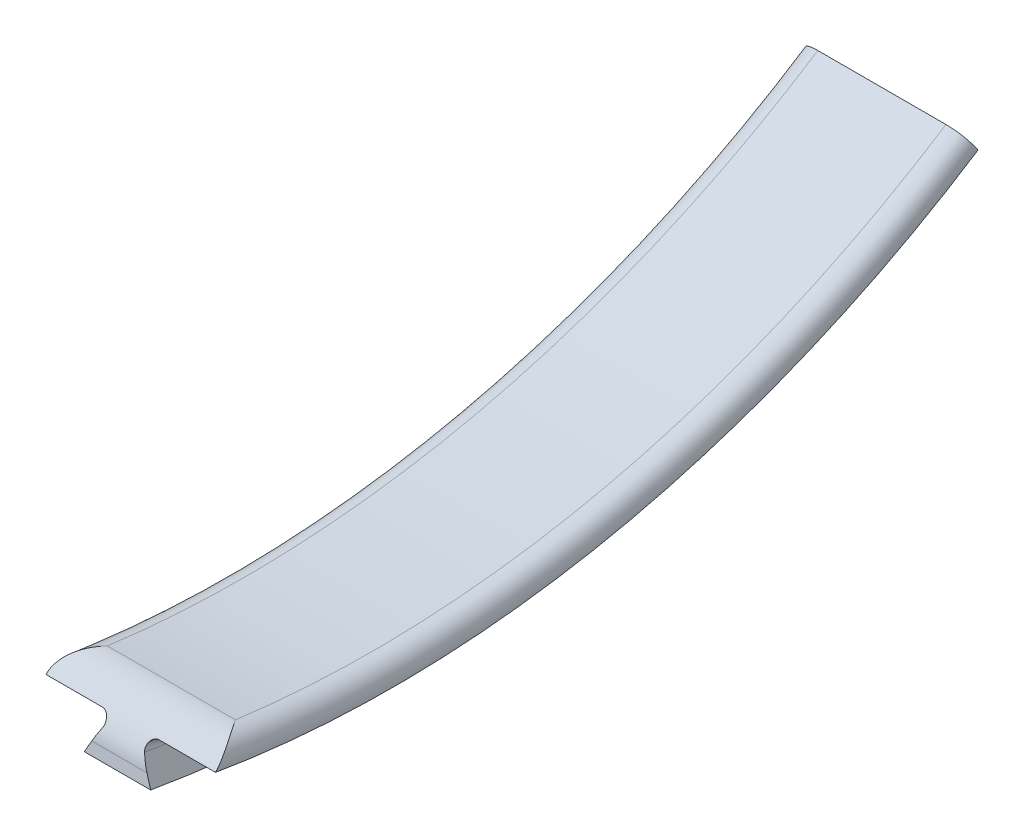
ISO-10303-21;
HEADER;
FILE_DESCRIPTION(('STEP AP214'),'2;1');
FILE_NAME('part.step','',(''),(''),'','','');
FILE_SCHEMA(('AUTOMOTIVE_DESIGN { 1 0 10303 214 1 1 1 1 }'));
ENDSEC;
DATA;
#1=APPLICATION_CONTEXT('core data for automotive mechanical design processes');
#2=APPLICATION_PROTOCOL_DEFINITION('international standard','automotive_design',2000,#1);
#3=PRODUCT_CONTEXT('',#1,'mechanical');
#4=PRODUCT('Part','Part','',(#3));
#5=PRODUCT_RELATED_PRODUCT_CATEGORY('part','',(#4));
#6=PRODUCT_DEFINITION_FORMATION('','',#4);
#7=PRODUCT_DEFINITION_CONTEXT('part definition',#1,'design');
#8=PRODUCT_DEFINITION('design','',#6,#7);
#9=PRODUCT_DEFINITION_SHAPE('','',#8);
#10=(LENGTH_UNIT() NAMED_UNIT(*) SI_UNIT(.MILLI.,.METRE.));
#11=(NAMED_UNIT(*) PLANE_ANGLE_UNIT() SI_UNIT($,.RADIAN.));
#12=(NAMED_UNIT(*) SI_UNIT($,.STERADIAN.) SOLID_ANGLE_UNIT());
#13=UNCERTAINTY_MEASURE_WITH_UNIT(LENGTH_MEASURE(1.E-05),#10,'distance_accuracy_value','');
#14=(GEOMETRIC_REPRESENTATION_CONTEXT(3) GLOBAL_UNCERTAINTY_ASSIGNED_CONTEXT((#13)) GLOBAL_UNIT_ASSIGNED_CONTEXT((#10,
#11,#12)) REPRESENTATION_CONTEXT('',''));
#15=CARTESIAN_POINT('',(0.,0.,0.));
#16=DIRECTION('',(0.,0.,1.));
#17=DIRECTION('',(1.,0.,0.));
#18=AXIS2_PLACEMENT_3D('',#15,#16,#17);
#19=CARTESIAN_POINT('',(-2.75,0.,0.));
#20=DIRECTION('',(-1.,0.,0.));
#21=DIRECTION('',(0.,0.,1.));
#22=AXIS2_PLACEMENT_3D('',#19,#20,#21);
#23=TOROIDAL_SURFACE('',#22,46.,0.890624999999996);
#24=CARTESIAN_POINT('',(-3.64062500000001,0.,0.));
#25=DIRECTION('',(-1.,0.,0.));
#26=DIRECTION('',(0.,0.,1.));
#27=AXIS2_PLACEMENT_3D('',#24,#25,#26);
#28=CIRCLE('',#27,46.);
#29=CARTESIAN_POINT('',(-3.64062499999999,-38.5788461254896,-25.0533956106914));
#30=VERTEX_POINT('',#29);
#31=CARTESIAN_POINT('',(-3.640625,-45.3537906221012,7.68333756948193));
#32=VERTEX_POINT('',#31);
#33=EDGE_CURVE('E178',#30,#32,#28,.T.);
#34=ORIENTED_EDGE('',*,*,#33,.T.);
#35=CARTESIAN_POINT('',(-3.640625,-45.3537906221012,7.68333756948193));
#36=CARTESIAN_POINT('',(-3.64062274567191,-45.3254309579792,7.65756518256237));
#37=CARTESIAN_POINT('',(-3.63887276725548,-45.2978578432768,7.63100013225897));
#38=CARTESIAN_POINT('',(-3.63228194200173,-45.2445089036344,7.57659157920742));
#39=CARTESIAN_POINT('',(-3.62744783191571,-45.218729296869,7.54875098538744));
#40=CARTESIAN_POINT('',(-3.60906229038154,-45.144843926621,7.46429593910421));
#41=CARTESIAN_POINT('',(-3.59160724593499,-45.0994906277288,7.40610547547041));
#42=CARTESIAN_POINT('',(-3.54262105193984,-45.0043678469519,7.26956638943991));
#43=CARTESIAN_POINT('',(-3.5084528021534,-44.9572643359613,7.19034904056057));
#44=CARTESIAN_POINT('',(-3.43123910357162,-44.8753927726472,7.02938521403782));
#45=CARTESIAN_POINT('',(-3.38813888316778,-44.840704611571,6.94762591055819));
#46=CARTESIAN_POINT('',(-3.27626729766826,-44.7705784933463,6.74771318063099));
#47=CARTESIAN_POINT('',(-3.20445488194347,-44.7413037624321,6.62911156555094));
#48=CARTESIAN_POINT('',(-3.05498574601167,-44.7045380065496,6.39275164564827));
#49=CARTESIAN_POINT('',(-2.97733900053644,-44.697010632878,6.27499226220307));
#50=CARTESIAN_POINT('',(-2.85100690606666,-44.7012607806862,6.08750140565862));
#51=CARTESIAN_POINT('',(-2.80296788133305,-44.7065992224252,6.01713235544682));
#52=CARTESIAN_POINT('',(-2.75328743626528,-44.715931382603,5.94488099362165));
#53=CARTESIAN_POINT('',(-2.75164370922423,-44.716244461589,5.94249107641541));
#54=CARTESIAN_POINT('',(-2.74999999999999,-44.7165618532314,5.94010175979805));
#55=B_SPLINE_CURVE_WITH_KNOTS('',3,(#35,#36,#37,#38,#39,#40,#41,#42,#43,#44,#45,#46,#47,#48,#49,
#50,#51,#52,#53,#54),.UNSPECIFIED.,.F.,.F.,(4,2,2,2,2,2,2,2,2,4),(0.,0.114829770083758,
0.229409569210247,0.455760939163213,0.749107132341121,1.04430840140907,1.4671728741743,
1.88933015789866,2.14511105171432,2.15386341249852),.UNSPECIFIED.);
#56=CARTESIAN_POINT('',(-2.74999999999999,-44.7165618532314,5.94010175979805));
#57=VERTEX_POINT('',#56);
#58=EDGE_CURVE('E11',#32,#57,#55,.T.);
#59=ORIENTED_EDGE('',*,*,#58,.T.);
#60=CARTESIAN_POINT('',(-2.75,0.,0.));
#61=DIRECTION('',(-1.,0.,0.));
#62=DIRECTION('',(0.,0.,1.));
#63=AXIS2_PLACEMENT_3D('',#60,#61,#62);
#64=CIRCLE('',#63,45.109375);
#65=CARTESIAN_POINT('',(-2.74999999999999,-37.8319051509132,-24.5683264701312));
#66=VERTEX_POINT('',#65);
#67=EDGE_CURVE('E195',#66,#57,#64,.T.);
#68=ORIENTED_EDGE('',*,*,#67,.F.);
#69=CARTESIAN_POINT('',(-2.74999999999999,-38.5788461254896,-25.0533956106914));
#70=DIRECTION('',(0.,0.544639035015027,-0.838670567945423));
#71=DIRECTION('',(-1.,0.,0.));
#72=AXIS2_PLACEMENT_3D('',#69,#70,#71);
#73=CIRCLE('',#72,0.890624999999996);
#74=EDGE_CURVE('E149',#30,#66,#73,.T.);
#75=ORIENTED_EDGE('',*,*,#74,.F.);
#76=EDGE_LOOP('',(#34,#59,#68,#75));
#77=FACE_BOUND('',#76,.T.);
#78=ADVANCED_FACE('F34',(#77),#23,.T.);
#79=CARTESIAN_POINT('',(0.,0.,0.));
#80=DIRECTION('',(-1.,0.,0.));
#81=DIRECTION('',(0.,0.,1.));
#82=AXIS2_PLACEMENT_3D('',#79,#80,#81);
#83=CYLINDRICAL_SURFACE('',#82,45.109375);
#84=ORIENTED_EDGE('',*,*,#67,.T.);
#85=DIRECTION('',(-1.,0.,0.));
#86=VECTOR('',#85,1.);
#87=CARTESIAN_POINT('',(0.,-44.7165618532314,5.94010175979805));
#88=LINE('',#87,#86);
#89=CARTESIAN_POINT('',(2.75000000000001,-44.7165618532314,5.94010175979805));
#90=VERTEX_POINT('',#89);
#91=EDGE_CURVE('E198',#57,#90,#88,.F.);
#92=ORIENTED_EDGE('',*,*,#91,.T.);
#93=CARTESIAN_POINT('',(2.75,0.,0.));
#94=DIRECTION('',(-1.,0.,0.));
#95=DIRECTION('',(0.,0.,1.));
#96=AXIS2_PLACEMENT_3D('',#93,#94,#95);
#97=CIRCLE('',#96,45.109375);
#98=CARTESIAN_POINT('',(2.75000000000001,-37.8319051509132,-24.5683264701312));
#99=VERTEX_POINT('',#98);
#100=EDGE_CURVE('E192',#99,#90,#97,.T.);
#101=ORIENTED_EDGE('',*,*,#100,.F.);
#102=DIRECTION('',(1.,0.,0.));
#103=VECTOR('',#102,1.);
#104=CARTESIAN_POINT('',(-2.74999999999999,-37.8319051509132,-24.5683264701312));
#105=LINE('',#104,#103);
#106=EDGE_CURVE('E154',#66,#99,#105,.T.);
#107=ORIENTED_EDGE('',*,*,#106,.F.);
#108=EDGE_LOOP('',(#84,#92,#101,#107));
#109=FACE_BOUND('',#108,.T.);
#110=ADVANCED_FACE('F215',(#109),#83,.F.);
#111=CARTESIAN_POINT('',(2.75,0.,0.));
#112=DIRECTION('',(-1.,0.,0.));
#113=DIRECTION('',(0.,0.,1.));
#114=AXIS2_PLACEMENT_3D('',#111,#112,#113);
#115=TOROIDAL_SURFACE('',#114,46.,0.890624999999992);
#116=ORIENTED_EDGE('',*,*,#100,.T.);
#117=CARTESIAN_POINT('',(3.64062500000001,-45.3537906221012,7.68333756948193));
#118=CARTESIAN_POINT('',(3.6406227456719,-45.3254309579792,7.65756518256237));
#119=CARTESIAN_POINT('',(3.63887276725546,-45.2978578432768,7.63100013225897));
#120=CARTESIAN_POINT('',(3.6322819420017,-45.2445089036344,7.57659157920742));
#121=CARTESIAN_POINT('',(3.62744783191568,-45.218729296869,7.54875098538743));
#122=CARTESIAN_POINT('',(3.60906229038152,-45.144843926621,7.46429593910421));
#123=CARTESIAN_POINT('',(3.591607245935,-45.0994906277288,7.4061054754704));
#124=CARTESIAN_POINT('',(3.54262105193986,-45.0043678469519,7.26956638943992));
#125=CARTESIAN_POINT('',(3.50845280215338,-44.9572643359613,7.19034904056059));
#126=CARTESIAN_POINT('',(3.43123910357161,-44.8753927726473,7.02938521403783));
#127=CARTESIAN_POINT('',(3.38813888316781,-44.840704611571,6.94762591055818));
#128=CARTESIAN_POINT('',(3.27626729766824,-44.7705784933463,6.74771318063101));
#129=CARTESIAN_POINT('',(3.20445488194329,-44.7413037624321,6.62911156555106));
#130=CARTESIAN_POINT('',(3.05498574601181,-44.7045380065497,6.39275164564818));
#131=CARTESIAN_POINT('',(2.97733900053706,-44.6970106328782,6.27499226220266));
#132=CARTESIAN_POINT('',(2.85100690606628,-44.7012607806861,6.08750140565888));
#133=CARTESIAN_POINT('',(2.80296788133188,-44.7065992224249,6.01713235544761));
#134=CARTESIAN_POINT('',(2.75328743626522,-44.715931382603,5.94488099362171));
#135=CARTESIAN_POINT('',(2.75164370922421,-44.716244461589,5.94249107641544));
#136=CARTESIAN_POINT('',(2.75000000000001,-44.7165618532314,5.94010175979805));
#137=B_SPLINE_CURVE_WITH_KNOTS('',3,(#117,#118,#119,#120,#121,#122,#123,#124,#125,#126,#127,
#128,#129,#130,#131,#132,#133,#134,#135,#136),.UNSPECIFIED.,.F.,.F.,(4,2,2,2,2,2,2,2,2,4),(0.,
0.114829770083762,0.22940956921026,0.455760939163207,0.749107132341106,1.04430840140906,
1.46717287417429,1.88933015789866,2.14511105171429,2.15386341249851),.UNSPECIFIED.);
#138=CARTESIAN_POINT('',(3.64062500000001,-45.3537906221012,7.68333756948193));
#139=VERTEX_POINT('',#138);
#140=EDGE_CURVE('E201',#90,#139,#137,.F.);
#141=ORIENTED_EDGE('',*,*,#140,.T.);
#142=CARTESIAN_POINT('',(3.64062500000001,0.,0.));
#143=DIRECTION('',(-1.,0.,0.));
#144=DIRECTION('',(0.,0.,1.));
#145=AXIS2_PLACEMENT_3D('',#142,#143,#144);
#146=CIRCLE('',#145,46.);
#147=CARTESIAN_POINT('',(3.64062500000002,-38.5788461254896,-25.0533956106914));
#148=VERTEX_POINT('',#147);
#149=EDGE_CURVE('E189',#148,#139,#146,.T.);
#150=ORIENTED_EDGE('',*,*,#149,.F.);
#151=CARTESIAN_POINT('',(2.75000000000001,-38.5788461254896,-25.0533956106914));
#152=DIRECTION('',(0.,0.544639035015027,-0.838670567945423));
#153=DIRECTION('',(-1.,0.,0.));
#154=AXIS2_PLACEMENT_3D('',#151,#152,#153);
#155=CIRCLE('',#154,0.890624999999992);
#156=EDGE_CURVE('E157',#99,#148,#155,.T.);
#157=ORIENTED_EDGE('',*,*,#156,.F.);
#158=EDGE_LOOP('',(#116,#141,#150,#157));
#159=FACE_BOUND('',#158,.T.);
#160=ADVANCED_FACE('F210',(#159),#115,.T.);
#161=CARTESIAN_POINT('',(0.,0.,0.));
#162=DIRECTION('',(-1.,0.,0.));
#163=DIRECTION('',(0.,0.,1.));
#164=AXIS2_PLACEMENT_3D('',#161,#162,#163);
#165=CYLINDRICAL_SURFACE('',#164,46.);
#166=ORIENTED_EDGE('',*,*,#149,.T.);
#167=DIRECTION('',(-1.,0.,0.));
#168=VECTOR('',#167,1.);
#169=CARTESIAN_POINT('',(3.64062500000001,-45.3537906221012,7.68333756948193));
#170=LINE('',#169,#168);
#171=CARTESIAN_POINT('',(1.2177050983125,-45.3537906221012,7.68333756948193));
#172=VERTEX_POINT('',#171);
#173=EDGE_CURVE('E208',#139,#172,#170,.T.);
#174=ORIENTED_EDGE('',*,*,#173,.T.);
#175=CARTESIAN_POINT('',(1.21770509831249,0.,0.));
#176=DIRECTION('',(-1.,0.,0.));
#177=DIRECTION('',(0.,0.,1.));
#178=AXIS2_PLACEMENT_3D('',#175,#176,#177);
#179=CIRCLE('',#178,46.);
#180=CARTESIAN_POINT('',(1.2177050983125,-38.5788461254896,-25.0533956106914));
#181=VERTEX_POINT('',#180);
#182=EDGE_CURVE('E186',#181,#172,#179,.T.);
#183=ORIENTED_EDGE('',*,*,#182,.F.);
#184=DIRECTION('',(-1.,0.,0.));
#185=VECTOR('',#184,1.);
#186=CARTESIAN_POINT('',(1.2177050983125,-38.5788461254896,-25.0533956106914));
#187=LINE('',#186,#185);
#188=EDGE_CURVE('E160',#148,#181,#187,.T.);
#189=ORIENTED_EDGE('',*,*,#188,.F.);
#190=EDGE_LOOP('',(#166,#174,#183,#189));
#191=FACE_BOUND('',#190,.T.);
#192=ADVANCED_FACE('F214',(#191),#165,.T.);
#193=CARTESIAN_POINT('',(1.21770509831249,0.,0.));
#194=DIRECTION('',(-1.,0.,0.));
#195=DIRECTION('',(0.,0.,1.));
#196=AXIS2_PLACEMENT_3D('',#193,#194,#195);
#197=TOROIDAL_SURFACE('',#196,46.35,0.350000000000002);
#198=ORIENTED_EDGE('',*,*,#182,.T.);
#199=CARTESIAN_POINT('',(1.2177050983125,-45.3537906221012,7.68333756948193));
#200=CARTESIAN_POINT('',(1.19999568325692,-45.3537711653428,7.68331064435053));
#201=CARTESIAN_POINT('',(1.1823158326994,-45.354970311698,7.68441016381426));
#202=CARTESIAN_POINT('',(1.14760639660233,-45.3596388601951,7.688638863128));
#203=CARTESIAN_POINT('',(1.13057368400611,-45.3630953085381,7.6917564610982));
#204=CARTESIAN_POINT('',(1.09756377687571,-45.3721075437284,7.69979612041953));
#205=CARTESIAN_POINT('',(1.08158491829862,-45.3776599230988,7.70471525252706));
#206=CARTESIAN_POINT('',(1.05096090889374,-45.390641703684,7.71604395867044));
#207=CARTESIAN_POINT('',(1.03631753264115,-45.3980735542645,7.72245547673997));
#208=CARTESIAN_POINT('',(1.00758019422484,-45.4151968027593,7.73696198210821));
#209=CARTESIAN_POINT('',(0.993607343160351,-45.4250148243432,7.74514650884089));
#210=CARTESIAN_POINT('',(0.967660337097694,-45.4462900259636,7.7624853702463));
#211=CARTESIAN_POINT('',(0.955686895594502,-45.4577477884494,7.77164004922376));
#212=CARTESIAN_POINT('',(0.932285529743035,-45.4838416952484,7.79197079927259));
#213=CARTESIAN_POINT('',(0.921189224843221,-45.4986977771076,7.80324737216053));
#214=CARTESIAN_POINT('',(0.901970018777374,-45.5299356533665,7.82621810698249));
#215=CARTESIAN_POINT('',(0.893848363015756,-45.5463180832142,7.83791244157821));
#216=CARTESIAN_POINT('',(0.88024905798947,-45.5816079065869,7.86226178920577));
#217=CARTESIAN_POINT('',(0.875027858994053,-45.6006125695611,7.87492040850677));
#218=CARTESIAN_POINT('',(0.868487458732111,-45.6395392573912,7.8998647200816));
#219=CARTESIAN_POINT('',(0.867170199903631,-45.6594617339083,7.91215022370083));
#220=CARTESIAN_POINT('',(0.868620160145922,-45.699241585861,7.93572377729359));
#221=CARTESIAN_POINT('',(0.871310834792217,-45.7190931061354,7.94702626660956));
#222=CARTESIAN_POINT('',(0.88072935368721,-45.7583827692636,7.96853353595119));
#223=CARTESIAN_POINT('',(0.887445166819238,-45.7778219659781,7.97874148079475));
#224=CARTESIAN_POINT('',(0.898780581453556,-45.8024479123194,7.99119562085169));
#225=CARTESIAN_POINT('',(0.901626697855498,-45.8081743741044,7.99405618354128));
#226=CARTESIAN_POINT('',(0.904655581462532,-45.8138326040775,7.99684858125796));
#227=B_SPLINE_CURVE_WITH_KNOTS('',3,(#199,#200,#201,#202,#203,#204,#205,#206,#207,#208,#209,
#210,#211,#212,#213,#214,#215,#216,#217,#218,#219,#220,#221,#222,#223,#224,#225,#226),
.UNSPECIFIED.,.F.,.F.,(4,2,2,2,2,2,2,2,2,2,2,2,2,4),(0.,0.0530070019546674,0.105712458593837,
0.15833259539097,0.211021664441853,0.267614906683418,0.324228301424882,0.389061592502379,
0.453921996565028,0.523854866781625,0.593822526845199,0.662470948521256,0.730915196646064,
0.751919066792795),.UNSPECIFIED.);
#228=CARTESIAN_POINT('',(0.904655581462529,-45.8138326040775,7.99684858125796));
#229=VERTEX_POINT('',#228);
#230=EDGE_CURVE('E240',#172,#229,#227,.T.);
#231=ORIENTED_EDGE('',*,*,#230,.T.);
#232=CARTESIAN_POINT('',(0.904655581462519,0.,0.));
#233=DIRECTION('',(-1.,0.,0.));
#234=DIRECTION('',(0.,0.,1.));
#235=AXIS2_PLACEMENT_3D('',#232,#233,#234);
#236=CIRCLE('',#235,46.506524758425);
#237=CARTESIAN_POINT('',(0.904655581462526,-39.0036535323162,-25.3292687663312));
#238=VERTEX_POINT('',#237);
#239=EDGE_CURVE('E142',#238,#229,#236,.T.);
#240=ORIENTED_EDGE('',*,*,#239,.F.);
#241=CARTESIAN_POINT('',(1.2177050983125,-38.8723808242706,-25.2440192729467));
#242=DIRECTION('',(0.,-0.544639035015027,0.838670567945423));
#243=DIRECTION('',(1.,0.,0.));
#244=AXIS2_PLACEMENT_3D('',#241,#242,#243);
#245=CIRCLE('',#244,0.350000000000002);
#246=EDGE_CURVE('E163',#181,#238,#245,.T.);
#247=ORIENTED_EDGE('',*,*,#246,.F.);
#248=EDGE_LOOP('',(#198,#231,#240,#247));
#249=FACE_BOUND('',#248,.T.);
#250=ADVANCED_FACE('F239',(#249),#197,.F.);
#251=CARTESIAN_POINT('',(0.904655581462519,0.,0.));
#252=DIRECTION('',(1.,0.,0.));
#253=DIRECTION('',(0.,0.,-1.));
#254=AXIS2_PLACEMENT_3D('',#251,#252,#253);
#255=CONICAL_SURFACE('',#254,46.506524758425,1.10714871779409);
#256=ORIENTED_EDGE('',*,*,#239,.T.);
#257=CARTESIAN_POINT('',(0.904655581462529,-45.8138326040775,7.99684858125796));
#258=CARTESIAN_POINT('',(0.927535642330717,-45.856598799745,8.01796026023772));
#259=CARTESIAN_POINT('',(0.950608680133408,-45.9000271587106,8.03749652409113));
#260=CARTESIAN_POINT('',(0.996953306241776,-45.987852321255,8.07330608826003));
#261=CARTESIAN_POINT('',(1.02022371141099,-46.0322444884108,8.08959228757557));
#262=CARTESIAN_POINT('',(1.09040292533003,-46.1670001329081,8.13369027723022));
#263=CARTESIAN_POINT('',(1.13761001775299,-46.2588124225778,8.15667743992246));
#264=CARTESIAN_POINT('',(1.18484393142821,-46.351849466451,8.17308166667248));
#265=B_SPLINE_CURVE_WITH_KNOTS('',3,(#257,#258,#259,#260,#261,#262,#263,#264),.UNSPECIFIED.,.F.,
.F.,(4,2,2,4),(0.,0.158646069571011,0.316649395615424,0.633135530098646),.UNSPECIFIED.);
#266=CARTESIAN_POINT('',(1.18484393142821,-46.351849466451,8.17308166667248));
#267=VERTEX_POINT('',#266);
#268=EDGE_CURVE('E129',#229,#267,#265,.T.);
#269=ORIENTED_EDGE('',*,*,#268,.T.);
#270=DIRECTION('',(0.447213595499961,-0.880838832201648,0.155315651772885));
#271=VECTOR('',#270,1.);
#272=CARTESIAN_POINT('',(1.42639320225004,-46.8276086557305,8.25697084806246));
#273=LINE('',#272,#271);
#274=CARTESIAN_POINT('',(1.42639320225004,-46.8276086557305,8.25697084806246));
#275=VERTEX_POINT('',#274);
#276=EDGE_CURVE('E121',#267,#275,#273,.T.);
#277=ORIENTED_EDGE('',*,*,#276,.T.);
#278=CARTESIAN_POINT('',(1.42639320225003,0.,0.));
#279=DIRECTION('',(-1.,0.,0.));
#280=DIRECTION('',(0.,0.,1.));
#281=AXIS2_PLACEMENT_3D('',#278,#279,#280);
#282=CIRCLE('',#281,47.55);
#283=CARTESIAN_POINT('',(1.42639320225004,-39.878785505805,-25.8975861149647));
#284=VERTEX_POINT('',#283);
#285=EDGE_CURVE('E126',#284,#275,#282,.T.);
#286=ORIENTED_EDGE('',*,*,#285,.F.);
#287=DIRECTION('',(0.447213595499961,-0.750129760261731,-0.487139962197398));
#288=VECTOR('',#287,1.);
#289=CARTESIAN_POINT('',(1.42639320225004,-39.878785505805,-25.8975861149647));
#290=LINE('',#289,#288);
#291=EDGE_CURVE('E166',#238,#284,#290,.T.);
#292=ORIENTED_EDGE('',*,*,#291,.F.);
#293=EDGE_LOOP('',(#256,#269,#277,#286,#292));
#294=FACE_BOUND('',#293,.T.);
#295=ADVANCED_FACE('F124',(#294),#255,.F.);
#296=CARTESIAN_POINT('',(0.,0.,0.));
#297=DIRECTION('',(-1.,0.,0.));
#298=DIRECTION('',(0.,0.,1.));
#299=AXIS2_PLACEMENT_3D('',#296,#297,#298);
#300=CYLINDRICAL_SURFACE('',#299,47.55);
#301=CARTESIAN_POINT('',(-1.42639320225003,0.,0.));
#302=DIRECTION('',(-1.,0.,0.));
#303=DIRECTION('',(0.,0.,1.));
#304=AXIS2_PLACEMENT_3D('',#301,#302,#303);
#305=CIRCLE('',#304,47.55);
#306=CARTESIAN_POINT('',(-1.42639320225002,-39.878785505805,-25.8975861149647));
#307=VERTEX_POINT('',#306);
#308=CARTESIAN_POINT('',(-1.42639320225001,-46.8276086557305,8.25697084806246));
#309=VERTEX_POINT('',#308);
#310=EDGE_CURVE('E143',#307,#309,#305,.T.);
#311=ORIENTED_EDGE('',*,*,#310,.F.);
#312=DIRECTION('',(-1.,0.,0.));
#313=VECTOR('',#312,1.);
#314=CARTESIAN_POINT('',(-1.42639320225002,-39.878785505805,-25.8975861149647));
#315=LINE('',#314,#313);
#316=EDGE_CURVE('E141',#284,#307,#315,.T.);
#317=ORIENTED_EDGE('',*,*,#316,.F.);
#318=ORIENTED_EDGE('',*,*,#285,.T.);
#319=DIRECTION('',(-1.,0.,0.));
#320=VECTOR('',#319,1.);
#321=CARTESIAN_POINT('',(-1.42639320225001,-46.8276086557305,8.25697084806246));
#322=LINE('',#321,#320);
#323=EDGE_CURVE('E133',#275,#309,#322,.T.);
#324=ORIENTED_EDGE('',*,*,#323,.T.);
#325=EDGE_LOOP('',(#311,#317,#318,#324));
#326=FACE_BOUND('',#325,.T.);
#327=ADVANCED_FACE('F138',(#326),#300,.T.);
#328=CARTESIAN_POINT('',(-1.42639320225003,0.,0.));
#329=DIRECTION('',(-1.,0.,0.));
#330=DIRECTION('',(0.,0.,1.));
#331=AXIS2_PLACEMENT_3D('',#328,#329,#330);
#332=CONICAL_SURFACE('',#331,47.55,1.10714871779409);
#333=DIRECTION('',(0.447213595499962,0.880838832201647,-0.155315651772885));
#334=VECTOR('',#333,1.);
#335=CARTESIAN_POINT('',(-0.904655581462506,-45.7999861477512,8.07577327392239));
#336=LINE('',#335,#334);
#337=CARTESIAN_POINT('',(-1.18484393142818,-46.351849466451,8.17308166667248));
#338=VERTEX_POINT('',#337);
#339=EDGE_CURVE('E147',#309,#338,#336,.T.);
#340=ORIENTED_EDGE('',*,*,#339,.T.);
#341=CARTESIAN_POINT('',(-1.18484393142818,-46.351849466451,8.17308166667248));
#342=CARTESIAN_POINT('',(-1.13761001775298,-46.2588124225778,8.15667743992247));
#343=CARTESIAN_POINT('',(-1.09040292533004,-46.1670001329081,8.13369027723022));
#344=CARTESIAN_POINT('',(-1.020223711411,-46.0322444884108,8.08959228757556));
#345=CARTESIAN_POINT('',(-0.996953306241791,-45.987852321255,8.07330608826002));
#346=CARTESIAN_POINT('',(-0.950608680133414,-45.9000271587106,8.03749652409113));
#347=CARTESIAN_POINT('',(-0.927535642330713,-45.856598799745,8.01796026023772));
#348=CARTESIAN_POINT('',(-0.904655581462512,-45.8138326040775,7.99684858125796));
#349=B_SPLINE_CURVE_WITH_KNOTS('',3,(#341,#342,#343,#344,#345,#346,#347,#348),.UNSPECIFIED.,.F.,
.F.,(4,2,2,4),(0.,0.316486134483218,0.474489460527618,0.633135530098642),.UNSPECIFIED.);
#350=CARTESIAN_POINT('',(-0.904655581462508,-45.8138326040775,7.99684858125796));
#351=VERTEX_POINT('',#350);
#352=EDGE_CURVE('E243',#338,#351,#349,.T.);
#353=ORIENTED_EDGE('',*,*,#352,.T.);
#354=CARTESIAN_POINT('',(-0.904655581462518,0.,0.));
#355=DIRECTION('',(-1.,0.,0.));
#356=DIRECTION('',(0.,0.,1.));
#357=AXIS2_PLACEMENT_3D('',#354,#355,#356);
#358=CIRCLE('',#357,46.506524758425);
#359=CARTESIAN_POINT('',(-0.904655581462511,-39.0036535323162,-25.3292687663312));
#360=VERTEX_POINT('',#359);
#361=EDGE_CURVE('E182',#360,#351,#358,.T.);
#362=ORIENTED_EDGE('',*,*,#361,.F.);
#363=DIRECTION('',(0.447213595499962,0.75012976026173,0.487139962197398));
#364=VECTOR('',#363,1.);
#365=CARTESIAN_POINT('',(-0.90465558146251,-39.0036535323162,-25.3292687663312));
#366=LINE('',#365,#364);
#367=EDGE_CURVE('E169',#307,#360,#366,.T.);
#368=ORIENTED_EDGE('',*,*,#367,.F.);
#369=ORIENTED_EDGE('',*,*,#310,.T.);
#370=EDGE_LOOP('',(#340,#353,#362,#368,#369));
#371=FACE_BOUND('',#370,.T.);
#372=ADVANCED_FACE('F301',(#371),#332,.F.);
#373=CARTESIAN_POINT('',(-1.21770509831249,0.,0.));
#374=DIRECTION('',(-1.,0.,0.));
#375=DIRECTION('',(0.,0.,1.));
#376=AXIS2_PLACEMENT_3D('',#373,#374,#375);
#377=TOROIDAL_SURFACE('',#376,46.35,0.350000000000004);
#378=ORIENTED_EDGE('',*,*,#361,.T.);
#379=CARTESIAN_POINT('',(-0.904655581462508,-45.8138326040775,7.99684858125796));
#380=CARTESIAN_POINT('',(-0.8954426783854,-45.7966453457929,7.98837817567598));
#381=CARTESIAN_POINT('',(-0.887953702808791,-45.77887873026,7.97928719250224));
#382=CARTESIAN_POINT('',(-0.876442718018378,-45.7428357693304,7.9601312677927));
#383=CARTESIAN_POINT('',(-0.87240900815559,-45.7245613623116,7.95006974266638));
#384=CARTESIAN_POINT('',(-0.867767877384318,-45.6880490633202,7.92919178134797));
#385=CARTESIAN_POINT('',(-0.867156315997964,-45.6698111539213,7.91837627346027));
#386=CARTESIAN_POINT('',(-0.869225695115634,-45.6338180383441,7.89625163494784));
#387=CARTESIAN_POINT('',(-0.87190905272562,-45.6160631963082,7.88494214781931));
#388=CARTESIAN_POINT('',(-0.880656141959919,-45.5804677676744,7.861488833819));
#389=CARTESIAN_POINT('',(-0.886902866240768,-45.5626793692426,7.84933405167229));
#390=CARTESIAN_POINT('',(-0.902700597117821,-45.5284967871087,7.82519955024625));
#391=CARTESIAN_POINT('',(-0.912253144357368,-45.5121032579162,7.81321991531026));
#392=CARTESIAN_POINT('',(-0.934991670047324,-45.4803426637169,7.78931988841554));
#393=CARTESIAN_POINT('',(-0.948327481370482,-45.4650602090817,7.77742881465715));
#394=CARTESIAN_POINT('',(-0.978184906631906,-45.4368421694625,7.75488998541419));
#395=CARTESIAN_POINT('',(-0.994706871367652,-45.4239068432033,7.74424236704228));
#396=CARTESIAN_POINT('',(-1.02981946942031,-45.4013840675937,7.7253142579211));
#397=CARTESIAN_POINT('',(-1.04828359800509,-45.3916721838198,7.71694882463177));
#398=CARTESIAN_POINT('',(-1.08736486414795,-45.3753224606029,7.70266935763938));
#399=CARTESIAN_POINT('',(-1.10797537346398,-45.3686754823868,7.69674804180414));
#400=CARTESIAN_POINT('',(-1.14356482914015,-45.3604945028003,7.68941127597684));
#401=CARTESIAN_POINT('',(-1.15815606554364,-45.3579969258856,7.68715359878358));
#402=CARTESIAN_POINT('',(-1.18772556991508,-45.3546380221631,7.68410800396081));
#403=CARTESIAN_POINT('',(-1.20270499180094,-45.3537823259257,7.68332514415075));
#404=CARTESIAN_POINT('',(-1.21770509831248,-45.3537906221012,7.68333756948193));
#405=B_SPLINE_CURVE_WITH_KNOTS('',3,(#379,#380,#381,#382,#383,#384,#385,#386,#387,#388,#389,
#390,#391,#392,#393,#394,#395,#396,#397,#398,#399,#400,#401,#402,#403,#404),.UNSPECIFIED.,.F.,
.F.,(4,2,2,2,2,2,2,2,2,2,2,2,4),(0.,0.0636540978452547,0.127091780405642,0.190452692712363,
0.253860113469588,0.320861748651712,0.387894651371797,0.458082100125666,0.52827728097799,
0.5953145144643,0.662150546288678,0.706916933710157,0.751836567911919),.UNSPECIFIED.);
#406=CARTESIAN_POINT('',(-1.21770509831248,-45.3537906221012,7.68333756948193));
#407=VERTEX_POINT('',#406);
#408=EDGE_CURVE('E62',#351,#407,#405,.T.);
#409=ORIENTED_EDGE('',*,*,#408,.T.);
#410=CARTESIAN_POINT('',(-1.21770509831249,0.,0.));
#411=DIRECTION('',(-1.,0.,0.));
#412=DIRECTION('',(0.,0.,1.));
#413=AXIS2_PLACEMENT_3D('',#410,#411,#412);
#414=CIRCLE('',#413,46.);
#415=CARTESIAN_POINT('',(-1.21770509831248,-38.5788461254896,-25.0533956106914));
#416=VERTEX_POINT('',#415);
#417=EDGE_CURVE('E180',#416,#407,#414,.T.);
#418=ORIENTED_EDGE('',*,*,#417,.F.);
#419=CARTESIAN_POINT('',(-1.21770509831248,-38.8723808242706,-25.2440192729467));
#420=DIRECTION('',(0.,-0.544639035015027,0.838670567945423));
#421=DIRECTION('',(-1.,0.,0.));
#422=AXIS2_PLACEMENT_3D('',#419,#420,#421);
#423=CIRCLE('',#422,0.350000000000004);
#424=EDGE_CURVE('E172',#360,#416,#423,.T.);
#425=ORIENTED_EDGE('',*,*,#424,.F.);
#426=EDGE_LOOP('',(#378,#409,#418,#425));
#427=FACE_BOUND('',#426,.T.);
#428=ADVANCED_FACE('F308',(#427),#377,.F.);
#429=CARTESIAN_POINT('',(0.,0.,0.));
#430=DIRECTION('',(-1.,0.,0.));
#431=DIRECTION('',(0.,0.,1.));
#432=AXIS2_PLACEMENT_3D('',#429,#430,#431);
#433=CYLINDRICAL_SURFACE('',#432,46.);
#434=ORIENTED_EDGE('',*,*,#417,.T.);
#435=DIRECTION('',(-1.,0.,0.));
#436=VECTOR('',#435,1.);
#437=CARTESIAN_POINT('',(-1.21770509831248,-45.3537906221012,7.68333756948193));
#438=LINE('',#437,#436);
#439=EDGE_CURVE('E48',#407,#32,#438,.T.);
#440=ORIENTED_EDGE('',*,*,#439,.T.);
#441=ORIENTED_EDGE('',*,*,#33,.F.);
#442=DIRECTION('',(-1.,0.,0.));
#443=VECTOR('',#442,1.);
#444=CARTESIAN_POINT('',(-3.64062499999999,-38.5788461254896,-25.0533956106914));
#445=LINE('',#444,#443);
#446=EDGE_CURVE('E175',#416,#30,#445,.T.);
#447=ORIENTED_EDGE('',*,*,#446,.F.);
#448=EDGE_LOOP('',(#434,#440,#441,#447));
#449=FACE_BOUND('',#448,.T.);
#450=ADVANCED_FACE('F316',(#449),#433,.T.);
#451=CARTESIAN_POINT('',(-2.74999999999999,-38.5788461254896,-25.0533956106914));
#452=DIRECTION('',(0.,0.544639035015027,-0.838670567945423));
#453=DIRECTION('',(-1.,0.,0.));
#454=AXIS2_PLACEMENT_3D('',#451,#452,#453);
#455=PLANE('',#454);
#456=ORIENTED_EDGE('',*,*,#74,.T.);
#457=ORIENTED_EDGE('',*,*,#106,.T.);
#458=ORIENTED_EDGE('',*,*,#156,.T.);
#459=ORIENTED_EDGE('',*,*,#188,.T.);
#460=ORIENTED_EDGE('',*,*,#246,.T.);
#461=ORIENTED_EDGE('',*,*,#291,.T.);
#462=ORIENTED_EDGE('',*,*,#316,.T.);
#463=ORIENTED_EDGE('',*,*,#367,.T.);
#464=ORIENTED_EDGE('',*,*,#424,.T.);
#465=ORIENTED_EDGE('',*,*,#446,.T.);
#466=EDGE_LOOP('',(#456,#457,#458,#459,#460,#461,#462,#463,#464,#465));
#467=FACE_BOUND('',#466,.T.);
#468=ADVANCED_FACE('F237',(#467),#455,.T.);
#469=CARTESIAN_POINT('',(-2.74999999999999,-45.3011566385616,7.98781617267869));
#470=DIRECTION('',(0.,-0.173648177666933,-0.98480775301221));
#471=DIRECTION('',(-1.,0.,0.));
#472=AXIS2_PLACEMENT_3D('',#469,#470,#471);
#473=PLANE('',#472);
#474=ORIENTED_EDGE('',*,*,#276,.F.);
#475=DIRECTION('',(-1.,0.,0.));
#476=VECTOR('',#475,1.);
#477=CARTESIAN_POINT('',(-2.74999999999999,-46.351849466451,8.17308166667248));
#478=LINE('',#477,#476);
#479=EDGE_CURVE('E241',#267,#338,#478,.T.);
#480=ORIENTED_EDGE('',*,*,#479,.T.);
#481=ORIENTED_EDGE('',*,*,#339,.F.);
#482=ORIENTED_EDGE('',*,*,#323,.F.);
#483=EDGE_LOOP('',(#474,#480,#481,#482));
#484=FACE_BOUND('',#483,.T.);
#485=ADVANCED_FACE('F145',(#484),#473,.F.);
#486=CARTESIAN_POINT('',(0.,-46.6991458217849,6.20346616064806));
#487=DIRECTION('',(-1.,0.,0.));
#488=DIRECTION('',(0.,0.,1.));
#489=AXIS2_PLACEMENT_3D('',#486,#487,#488);
#490=CYLINDRICAL_SURFACE('',#489,2.);
#491=ORIENTED_EDGE('',*,*,#352,.F.);
#492=ORIENTED_EDGE('',*,*,#479,.F.);
#493=ORIENTED_EDGE('',*,*,#268,.F.);
#494=ORIENTED_EDGE('',*,*,#230,.F.);
#495=ORIENTED_EDGE('',*,*,#173,.F.);
#496=ORIENTED_EDGE('',*,*,#140,.F.);
#497=ORIENTED_EDGE('',*,*,#91,.F.);
#498=ORIENTED_EDGE('',*,*,#58,.F.);
#499=ORIENTED_EDGE('',*,*,#439,.F.);
#500=ORIENTED_EDGE('',*,*,#408,.F.);
#501=EDGE_LOOP('',(#491,#492,#493,#494,#495,#496,#497,#498,#499,#500));
#502=FACE_BOUND('',#501,.T.);
#503=ADVANCED_FACE('F36',(#502),#490,.T.);
#504=CLOSED_SHELL('',(#78,#110,#160,#192,#250,#295,#327,#372,#428,#450,#468,#485,#503));
#505=MANIFOLD_SOLID_BREP('B2',#504);
#506=ADVANCED_BREP_SHAPE_REPRESENTATION('',(#18,#505),#14);
#507=SHAPE_DEFINITION_REPRESENTATION(#9,#506);
ENDSEC;
END-ISO-10303-21;
